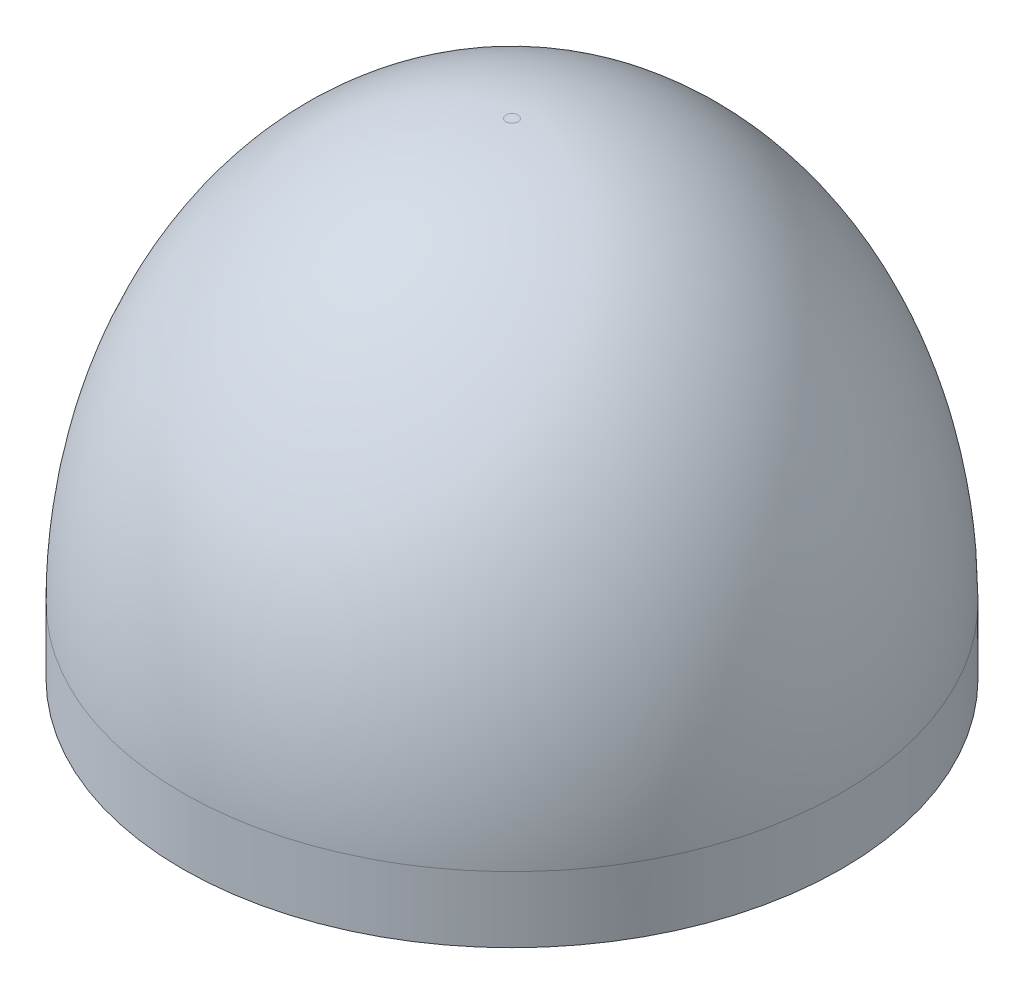
ISO-10303-21;
HEADER;
FILE_DESCRIPTION(('STEP AP214'),'2;1');
FILE_NAME('part.step','',(''),(''),'','','');
FILE_SCHEMA(('AUTOMOTIVE_DESIGN { 1 0 10303 214 1 1 1 1 }'));
ENDSEC;
DATA;
#1=APPLICATION_CONTEXT('core data for automotive mechanical design processes');
#2=APPLICATION_PROTOCOL_DEFINITION('international standard','automotive_design',2000,#1);
#3=PRODUCT_CONTEXT('',#1,'mechanical');
#4=PRODUCT('Part','Part','',(#3));
#5=PRODUCT_RELATED_PRODUCT_CATEGORY('part','',(#4));
#6=PRODUCT_DEFINITION_FORMATION('','',#4);
#7=PRODUCT_DEFINITION_CONTEXT('part definition',#1,'design');
#8=PRODUCT_DEFINITION('design','',#6,#7);
#9=PRODUCT_DEFINITION_SHAPE('','',#8);
#10=(LENGTH_UNIT() NAMED_UNIT(*) SI_UNIT(.MILLI.,.METRE.));
#11=(NAMED_UNIT(*) PLANE_ANGLE_UNIT() SI_UNIT($,.RADIAN.));
#12=(NAMED_UNIT(*) SI_UNIT($,.STERADIAN.) SOLID_ANGLE_UNIT());
#13=UNCERTAINTY_MEASURE_WITH_UNIT(LENGTH_MEASURE(1.E-05),#10,'distance_accuracy_value','');
#14=(GEOMETRIC_REPRESENTATION_CONTEXT(3) GLOBAL_UNCERTAINTY_ASSIGNED_CONTEXT((#13)) GLOBAL_UNIT_ASSIGNED_CONTEXT((#10,
#11,#12)) REPRESENTATION_CONTEXT('',''));
#15=CARTESIAN_POINT('',(0.,0.,0.));
#16=DIRECTION('',(0.,0.,1.));
#17=DIRECTION('',(1.,0.,0.));
#18=AXIS2_PLACEMENT_3D('',#15,#16,#17);
#19=CARTESIAN_POINT('',(0.,3.,0.));
#20=DIRECTION('',(0.,1.,0.));
#21=DIRECTION('',(0.,0.,1.));
#22=AXIS2_PLACEMENT_3D('',#19,#20,#21);
#23=PLANE('',#22);
#24=CARTESIAN_POINT('',(-41.7499999999988,3.,1.18404991852615E-12));
#25=DIRECTION('',(0.,1.,0.));
#26=DIRECTION('',(0.,0.,1.));
#27=AXIS2_PLACEMENT_3D('',#24,#25,#26);
#28=CIRCLE('',#27,1.45);
#29=CARTESIAN_POINT('',(-41.7499999999988,3.,1.45000000000118));
#30=VERTEX_POINT('',#29);
#31=EDGE_CURVE('E348',#30,#30,#28,.T.);
#32=ORIENTED_EDGE('',*,*,#31,.F.);
#33=EDGE_LOOP('',(#32));
#34=FACE_BOUND('',#33,.T.);
#35=CARTESIAN_POINT('',(41.7500000000012,3.,-1.17893701813971E-12));
#36=DIRECTION('',(0.,1.,0.));
#37=DIRECTION('',(0.,0.,1.));
#38=AXIS2_PLACEMENT_3D('',#35,#36,#37);
#39=CIRCLE('',#38,1.45);
#40=CARTESIAN_POINT('',(41.7500000000012,3.,1.44999999999882));
#41=VERTEX_POINT('',#40);
#42=EDGE_CURVE('E357',#41,#41,#39,.T.);
#43=ORIENTED_EDGE('',*,*,#42,.F.);
#44=EDGE_LOOP('',(#43));
#45=FACE_BOUND('',#44,.T.);
#46=CARTESIAN_POINT('',(0.,3.,0.));
#47=DIRECTION('',(0.,1.,0.));
#48=DIRECTION('',(0.,0.,1.));
#49=AXIS2_PLACEMENT_3D('',#46,#47,#48);
#50=CIRCLE('',#49,36.5);
#51=CARTESIAN_POINT('',(0.,3.,36.5));
#52=VERTEX_POINT('',#51);
#53=EDGE_CURVE('E78',#52,#52,#50,.T.);
#54=ORIENTED_EDGE('',*,*,#53,.F.);
#55=EDGE_LOOP('',(#54));
#56=FACE_BOUND('',#55,.T.);
#57=CARTESIAN_POINT('',(0.,3.,-41.75));
#58=DIRECTION('',(0.,1.,0.));
#59=DIRECTION('',(0.,0.,1.));
#60=AXIS2_PLACEMENT_3D('',#57,#58,#59);
#61=CIRCLE('',#60,1.45);
#62=CARTESIAN_POINT('',(0.,3.,-40.3));
#63=VERTEX_POINT('',#62);
#64=EDGE_CURVE('E361',#63,#63,#61,.T.);
#65=ORIENTED_EDGE('',*,*,#64,.F.);
#66=EDGE_LOOP('',(#65));
#67=FACE_BOUND('',#66,.T.);
#68=CARTESIAN_POINT('',(2.35787403627941E-12,3.,41.75));
#69=DIRECTION('',(0.,1.,0.));
#70=DIRECTION('',(0.,0.,1.));
#71=AXIS2_PLACEMENT_3D('',#68,#69,#70);
#72=CIRCLE('',#71,1.45);
#73=CARTESIAN_POINT('',(2.35787403627941E-12,3.,43.2));
#74=VERTEX_POINT('',#73);
#75=EDGE_CURVE('E353',#74,#74,#72,.T.);
#76=ORIENTED_EDGE('',*,*,#75,.F.);
#77=EDGE_LOOP('',(#76));
#78=FACE_BOUND('',#77,.T.);
#79=CARTESIAN_POINT('',(0.,3.,0.));
#80=DIRECTION('',(0.,1.,0.));
#81=DIRECTION('',(0.,0.,1.));
#82=AXIS2_PLACEMENT_3D('',#79,#80,#81);
#83=CIRCLE('',#82,52.);
#84=CARTESIAN_POINT('',(0.,3.,52.));
#85=VERTEX_POINT('',#84);
#86=EDGE_CURVE('E68',#85,#85,#83,.F.);
#87=ORIENTED_EDGE('',*,*,#86,.F.);
#88=EDGE_LOOP('',(#87));
#89=FACE_BOUND('',#88,.T.);
#90=ADVANCED_FACE('F40',(#34,#45,#56,#67,#78,#89),#23,.T.);
#91=CARTESIAN_POINT('',(0.,0.,0.));
#92=DIRECTION('',(0.,1.,0.));
#93=DIRECTION('',(0.,0.,1.));
#94=AXIS2_PLACEMENT_3D('',#91,#92,#93);
#95=PLANE('',#94);
#96=CARTESIAN_POINT('',(0.,0.,0.));
#97=DIRECTION('',(0.,1.,0.));
#98=DIRECTION('',(0.,0.,1.));
#99=AXIS2_PLACEMENT_3D('',#96,#97,#98);
#100=CIRCLE('',#99,55.);
#101=CARTESIAN_POINT('',(0.,0.,55.));
#102=VERTEX_POINT('',#101);
#103=EDGE_CURVE('E73',#102,#102,#100,.T.);
#104=ORIENTED_EDGE('',*,*,#103,.F.);
#105=EDGE_LOOP('',(#104));
#106=FACE_BOUND('',#105,.T.);
#107=CARTESIAN_POINT('',(0.,0.,0.));
#108=DIRECTION('',(0.,1.,0.));
#109=DIRECTION('',(0.,0.,1.));
#110=AXIS2_PLACEMENT_3D('',#107,#108,#109);
#111=CIRCLE('',#110,36.5);
#112=CARTESIAN_POINT('',(0.,0.,36.5));
#113=VERTEX_POINT('',#112);
#114=EDGE_CURVE('E331',#113,#113,#111,.T.);
#115=ORIENTED_EDGE('',*,*,#114,.T.);
#116=EDGE_LOOP('',(#115));
#117=FACE_BOUND('',#116,.T.);
#118=CARTESIAN_POINT('',(0.,0.,-41.75));
#119=DIRECTION('',(0.,1.,0.));
#120=DIRECTION('',(0.,0.,1.));
#121=AXIS2_PLACEMENT_3D('',#118,#119,#120);
#122=CIRCLE('',#121,1.45);
#123=CARTESIAN_POINT('',(0.,0.,-40.3));
#124=VERTEX_POINT('',#123);
#125=EDGE_CURVE('E335',#124,#124,#122,.T.);
#126=ORIENTED_EDGE('',*,*,#125,.T.);
#127=EDGE_LOOP('',(#126));
#128=FACE_BOUND('',#127,.T.);
#129=CARTESIAN_POINT('',(41.7500000000012,0.,-1.17893701813971E-12));
#130=DIRECTION('',(0.,1.,0.));
#131=DIRECTION('',(0.,0.,1.));
#132=AXIS2_PLACEMENT_3D('',#129,#130,#131);
#133=CIRCLE('',#132,1.45);
#134=CARTESIAN_POINT('',(41.7500000000012,0.,1.44999999999882));
#135=VERTEX_POINT('',#134);
#136=EDGE_CURVE('E339',#135,#135,#133,.T.);
#137=ORIENTED_EDGE('',*,*,#136,.T.);
#138=EDGE_LOOP('',(#137));
#139=FACE_BOUND('',#138,.T.);
#140=CARTESIAN_POINT('',(2.35787403627941E-12,0.,41.75));
#141=DIRECTION('',(0.,1.,0.));
#142=DIRECTION('',(0.,0.,1.));
#143=AXIS2_PLACEMENT_3D('',#140,#141,#142);
#144=CIRCLE('',#143,1.45);
#145=CARTESIAN_POINT('',(2.35787403627941E-12,0.,43.2));
#146=VERTEX_POINT('',#145);
#147=EDGE_CURVE('E343',#146,#146,#144,.T.);
#148=ORIENTED_EDGE('',*,*,#147,.T.);
#149=EDGE_LOOP('',(#148));
#150=FACE_BOUND('',#149,.T.);
#151=CARTESIAN_POINT('',(-41.7499999999988,0.,1.18404991852615E-12));
#152=DIRECTION('',(0.,1.,0.));
#153=DIRECTION('',(0.,0.,1.));
#154=AXIS2_PLACEMENT_3D('',#151,#152,#153);
#155=CIRCLE('',#154,1.45);
#156=CARTESIAN_POINT('',(-41.7499999999988,0.,1.45000000000118));
#157=VERTEX_POINT('',#156);
#158=EDGE_CURVE('E346',#157,#157,#155,.T.);
#159=ORIENTED_EDGE('',*,*,#158,.T.);
#160=EDGE_LOOP('',(#159));
#161=FACE_BOUND('',#160,.T.);
#162=ADVANCED_FACE('F122',(#106,#117,#128,#139,#150,#161),#95,.F.);
#163=CARTESIAN_POINT('',(0.,3.,0.));
#164=DIRECTION('',(0.,-1.,0.));
#165=DIRECTION('',(0.,0.,-1.));
#166=AXIS2_PLACEMENT_3D('',#163,#164,#165);
#167=CYLINDRICAL_SURFACE('',#166,55.);
#168=CARTESIAN_POINT('',(0.,11.,55.));
#169=CARTESIAN_POINT('',(7.1994819645649,11.,55.));
#170=CARTESIAN_POINT('',(14.3961347483359,11.,53.5684967575703));
#171=CARTESIAN_POINT('',(27.699042811824,11.,48.0582518186712));
#172=CARTESIAN_POINT('',(33.8000704470874,11.,43.9816754834328));
#173=CARTESIAN_POINT('',(43.9816754834328,11.,33.8000704470874));
#174=CARTESIAN_POINT('',(48.0582518186712,11.,27.6990428118239));
#175=CARTESIAN_POINT('',(53.5684967575703,11.,14.3961347483359));
#176=CARTESIAN_POINT('',(55.,11.,7.19948196456281));
#177=CARTESIAN_POINT('',(55.,11.,-7.19948196456281));
#178=CARTESIAN_POINT('',(53.5684967575702,11.,-14.3961347483364));
#179=CARTESIAN_POINT('',(48.0582518186714,11.,-27.6990428118235));
#180=CARTESIAN_POINT('',(43.9816754834329,11.,-33.8000704470873));
#181=CARTESIAN_POINT('',(33.8000704470873,11.,-43.981675483433));
#182=CARTESIAN_POINT('',(27.6990428118237,11.,-48.0582518186713));
#183=CARTESIAN_POINT('',(14.3961347483363,11.,-53.5684967575702));
#184=CARTESIAN_POINT('',(7.19948196456282,11.,-55.));
#185=CARTESIAN_POINT('',(-7.1994819645628,11.,-55.));
#186=CARTESIAN_POINT('',(-14.3961347483362,11.,-53.5684967575702));
#187=CARTESIAN_POINT('',(-27.6990428118235,11.,-48.0582518186714));
#188=CARTESIAN_POINT('',(-33.8000704470873,11.,-43.9816754834329));
#189=CARTESIAN_POINT('',(-43.9816754834329,11.,-33.8000704470873));
#190=CARTESIAN_POINT('',(-48.0582518186713,11.,-27.6990428118237));
#191=CARTESIAN_POINT('',(-53.5684967575702,11.,-14.3961347483363));
#192=CARTESIAN_POINT('',(-55.,11.,-7.19948196456273));
#193=CARTESIAN_POINT('',(-55.,11.,7.1994819645629));
#194=CARTESIAN_POINT('',(-53.5684967575702,11.,14.3961347483363));
#195=CARTESIAN_POINT('',(-48.0582518186714,11.,27.6990428118234));
#196=CARTESIAN_POINT('',(-43.9816754834323,11.,33.8000704470879));
#197=CARTESIAN_POINT('',(-33.8000704470881,11.,43.9816754834321));
#198=CARTESIAN_POINT('',(-27.6990428118237,11.,48.0582518186713));
#199=CARTESIAN_POINT('',(-14.3961347483363,11.,53.5684967575702));
#200=CARTESIAN_POINT('',(-7.1994819645649,11.,55.));
#201=CARTESIAN_POINT('',(0.,11.,55.));
#202=(BOUNDED_CURVE() B_SPLINE_CURVE(3,(#168,#169,#170,#171,#172,#173,#174,#175,#176,#177,#178,
#179,#180,#181,#182,#183,#184,#185,#186,#187,#188,#189,#190,#191,#192,#193,#194,#195,#196,#197,
#198,#199,#200,#201),.UNSPECIFIED.,.T.,.F.) B_SPLINE_CURVE_WITH_KNOTS((4,2,2,2,2,2,2,2,2,2,2,2,
2,2,2,2,4),(0.,0.392699081698724,0.785398163397448,1.17809724509617,1.5707963267949,
1.96349540849362,2.35619449019234,2.74889357189107,3.14159265358979,3.53429173528852,
3.92699081698724,4.31968989868597,4.71238898038469,5.10508806208341,5.49778714378214,
5.89048622548086,6.28318530717959),
.UNSPECIFIED.) CURVE() GEOMETRIC_REPRESENTATION_ITEM() RATIONAL_B_SPLINE_CURVE((1.,1.,1.,1.,1.,
1.,1.,1.,1.,1.,1.,1.,1.,1.,1.,1.,1.,1.,1.,1.,1.,1.,1.,1.,1.,1.,1.,1.,1.,1.,1.,1.,1.,1.)) REPRESENTATION_ITEM(''));
#203=CARTESIAN_POINT('',(0.,11.,55.));
#204=VERTEX_POINT('',#203);
#205=EDGE_CURVE('E11',#204,#204,#202,.F.);
#206=ORIENTED_EDGE('',*,*,#205,.T.);
#207=EDGE_LOOP('',(#206));
#208=FACE_BOUND('',#207,.T.);
#209=ORIENTED_EDGE('',*,*,#103,.T.);
#210=EDGE_LOOP('',(#209));
#211=FACE_BOUND('',#210,.T.);
#212=ADVANCED_FACE('F118',(#208,#211),#167,.T.);
#213=CARTESIAN_POINT('',(0.,3.,0.));
#214=DIRECTION('',(0.,-1.,0.));
#215=DIRECTION('',(0.,0.,-1.));
#216=AXIS2_PLACEMENT_3D('',#213,#214,#215);
#217=CYLINDRICAL_SURFACE('',#216,36.5);
#218=ORIENTED_EDGE('',*,*,#53,.T.);
#219=EDGE_LOOP('',(#218));
#220=FACE_BOUND('',#219,.T.);
#221=ORIENTED_EDGE('',*,*,#114,.F.);
#222=EDGE_LOOP('',(#221));
#223=FACE_BOUND('',#222,.T.);
#224=ADVANCED_FACE('F114',(#220,#223),#217,.F.);
#225=CARTESIAN_POINT('',(0.,3.,-41.75));
#226=DIRECTION('',(0.,-1.,0.));
#227=DIRECTION('',(0.,0.,-1.));
#228=AXIS2_PLACEMENT_3D('',#225,#226,#227);
#229=CYLINDRICAL_SURFACE('',#228,1.45);
#230=ORIENTED_EDGE('',*,*,#64,.T.);
#231=EDGE_LOOP('',(#230));
#232=FACE_BOUND('',#231,.T.);
#233=ORIENTED_EDGE('',*,*,#125,.F.);
#234=EDGE_LOOP('',(#233));
#235=FACE_BOUND('',#234,.T.);
#236=ADVANCED_FACE('F110',(#232,#235),#229,.F.);
#237=CARTESIAN_POINT('',(41.7500000000012,3.,-1.17893701813971E-12));
#238=DIRECTION('',(0.,-1.,0.));
#239=DIRECTION('',(0.,0.,-1.));
#240=AXIS2_PLACEMENT_3D('',#237,#238,#239);
#241=CYLINDRICAL_SURFACE('',#240,1.45);
#242=ORIENTED_EDGE('',*,*,#42,.T.);
#243=EDGE_LOOP('',(#242));
#244=FACE_BOUND('',#243,.T.);
#245=ORIENTED_EDGE('',*,*,#136,.F.);
#246=EDGE_LOOP('',(#245));
#247=FACE_BOUND('',#246,.T.);
#248=ADVANCED_FACE('F106',(#244,#247),#241,.F.);
#249=CARTESIAN_POINT('',(2.35787403627941E-12,3.,41.75));
#250=DIRECTION('',(0.,-1.,0.));
#251=DIRECTION('',(0.,0.,-1.));
#252=AXIS2_PLACEMENT_3D('',#249,#250,#251);
#253=CYLINDRICAL_SURFACE('',#252,1.45);
#254=ORIENTED_EDGE('',*,*,#75,.T.);
#255=EDGE_LOOP('',(#254));
#256=FACE_BOUND('',#255,.T.);
#257=ORIENTED_EDGE('',*,*,#147,.F.);
#258=EDGE_LOOP('',(#257));
#259=FACE_BOUND('',#258,.T.);
#260=ADVANCED_FACE('F102',(#256,#259),#253,.F.);
#261=CARTESIAN_POINT('',(-41.7499999999988,3.,1.18404991852615E-12));
#262=DIRECTION('',(0.,-1.,0.));
#263=DIRECTION('',(0.,0.,-1.));
#264=AXIS2_PLACEMENT_3D('',#261,#262,#263);
#265=CYLINDRICAL_SURFACE('',#264,1.45);
#266=ORIENTED_EDGE('',*,*,#31,.T.);
#267=EDGE_LOOP('',(#266));
#268=FACE_BOUND('',#267,.T.);
#269=ORIENTED_EDGE('',*,*,#158,.F.);
#270=EDGE_LOOP('',(#269));
#271=FACE_BOUND('',#270,.T.);
#272=ADVANCED_FACE('F97',(#268,#271),#265,.F.);
#273=CARTESIAN_POINT('',(0.,78.,0.));
#274=DIRECTION('',(0.,-1.,0.));
#275=DIRECTION('',(0.,0.,-1.));
#276=AXIS2_PLACEMENT_3D('',#273,#274,#275);
#277=CYLINDRICAL_SURFACE('',#276,52.);
#278=CARTESIAN_POINT('',(0.,7.99999999999999,52.));
#279=CARTESIAN_POINT('',(-6.80678294831591,7.99999999999999,52.));
#280=CARTESIAN_POINT('',(-13.6108910347905,7.99999999999999,50.6465787526119));
#281=CARTESIAN_POINT('',(-26.188185931179,7.99999999999999,45.4368926285619));
#282=CARTESIAN_POINT('',(-31.9564302408827,7.99999999999999,41.5826750025183));
#283=CARTESIAN_POINT('',(-41.5826750025184,7.99999999999999,31.9564302408825));
#284=CARTESIAN_POINT('',(-45.4368926285621,7.99999999999999,26.1881859311785));
#285=CARTESIAN_POINT('',(-50.6465787526118,7.99999999999999,13.6108910347907));
#286=CARTESIAN_POINT('',(-52.,7.99999999999999,6.80678294831402));
#287=CARTESIAN_POINT('',(-52.,7.99999999999999,-6.80678294831386));
#288=CARTESIAN_POINT('',(-50.6465787526118,7.99999999999999,-13.6108910347908));
#289=CARTESIAN_POINT('',(-45.436892628562,7.99999999999999,-26.1881859311786));
#290=CARTESIAN_POINT('',(-41.5826750025187,7.99999999999999,-31.9564302408822));
#291=CARTESIAN_POINT('',(-31.9564302408823,7.99999999999999,-41.5826750025186));
#292=CARTESIAN_POINT('',(-26.1881859311787,7.99999999999999,-45.436892628562));
#293=CARTESIAN_POINT('',(-13.6108910347905,7.99999999999999,-50.6465787526119));
#294=CARTESIAN_POINT('',(-6.80678294831392,7.99999999999999,-52.));
#295=CARTESIAN_POINT('',(6.80678294831393,7.99999999999999,-52.));
#296=CARTESIAN_POINT('',(13.6108910347906,7.99999999999999,-50.6465787526118));
#297=CARTESIAN_POINT('',(26.1881859311788,7.99999999999999,-45.4368926285619));
#298=CARTESIAN_POINT('',(31.9564302408825,7.99999999999999,-41.5826750025185));
#299=CARTESIAN_POINT('',(41.5826750025184,7.99999999999999,-31.9564302408825));
#300=CARTESIAN_POINT('',(45.436892628562,7.99999999999999,-26.1881859311787));
#301=CARTESIAN_POINT('',(50.6465787526118,7.99999999999999,-13.6108910347906));
#302=CARTESIAN_POINT('',(52.,7.99999999999999,-6.80678294831393));
#303=CARTESIAN_POINT('',(52.,7.99999999999999,6.80678294831393));
#304=CARTESIAN_POINT('',(50.646578752612,7.99999999999999,13.6108910347902));
#305=CARTESIAN_POINT('',(45.4368926285618,7.99999999999999,26.1881859311791));
#306=CARTESIAN_POINT('',(41.5826750025186,7.99999999999999,31.9564302408823));
#307=CARTESIAN_POINT('',(31.9564302408823,7.99999999999999,41.5826750025186));
#308=CARTESIAN_POINT('',(26.1881859311789,7.99999999999999,45.4368926285619));
#309=CARTESIAN_POINT('',(13.6108910347905,7.99999999999999,50.6465787526119));
#310=CARTESIAN_POINT('',(6.8067829483159,7.99999999999999,52.));
#311=CARTESIAN_POINT('',(0.,7.99999999999999,52.));
#312=(BOUNDED_CURVE() B_SPLINE_CURVE(3,(#278,#279,#280,#281,#282,#283,#284,#285,#286,#287,#288,
#289,#290,#291,#292,#293,#294,#295,#296,#297,#298,#299,#300,#301,#302,#303,#304,#305,#306,#307,
#308,#309,#310,#311),.UNSPECIFIED.,.T.,.F.) B_SPLINE_CURVE_WITH_KNOTS((4,2,2,2,2,2,2,2,2,2,2,2,
2,2,2,2,4),(0.,0.392699081698725,0.785398163397448,1.17809724509617,1.5707963267949,
1.96349540849362,2.35619449019234,2.74889357189107,3.14159265358979,3.53429173528852,
3.92699081698724,4.31968989868597,4.71238898038469,5.10508806208341,5.49778714378214,
5.89048622548086,6.28318530717959),
.UNSPECIFIED.) CURVE() GEOMETRIC_REPRESENTATION_ITEM() RATIONAL_B_SPLINE_CURVE((1.,1.,1.,1.,1.,
1.,1.,1.,1.,1.,1.,1.,1.,1.,1.,1.,1.,1.,1.,1.,1.,1.,1.,1.,1.,1.,1.,1.,1.,1.,1.,1.,1.,1.)) REPRESENTATION_ITEM(''));
#313=CARTESIAN_POINT('',(0.,7.99999999999999,52.));
#314=VERTEX_POINT('',#313);
#315=EDGE_CURVE('E63',#314,#314,#312,.F.);
#316=ORIENTED_EDGE('',*,*,#315,.T.);
#317=EDGE_LOOP('',(#316));
#318=FACE_BOUND('',#317,.T.);
#319=ORIENTED_EDGE('',*,*,#86,.T.);
#320=EDGE_LOOP('',(#319));
#321=FACE_BOUND('',#320,.T.);
#322=ADVANCED_FACE('F86',(#318,#321),#277,.F.);
#323=CARTESIAN_POINT('',(0.,78.,0.));
#324=DIRECTION('',(0.,1.,0.));
#325=DIRECTION('',(0.,0.,1.));
#326=AXIS2_PLACEMENT_3D('',#323,#324,#325);
#327=PLANE('',#326);
#328=CARTESIAN_POINT('',(0.,78.,1.));
#329=CARTESIAN_POINT('',(0.130899672082998,78.,1.));
#330=CARTESIAN_POINT('',(0.261747904515201,78.,0.973972668319461));
#331=CARTESIAN_POINT('',(0.503618960214979,78.,0.873786396703114));
#332=CARTESIAN_POINT('',(0.614546735401586,78.,0.799666826971503));
#333=CARTESIAN_POINT('',(0.79966682697151,78.,0.614546735401593));
#334=CARTESIAN_POINT('',(0.873786396703115,78.,0.503618960214978));
#335=CARTESIAN_POINT('',(0.97397266831946,78.,0.261747904515202));
#336=CARTESIAN_POINT('',(1.,78.,0.13089967208296));
#337=CARTESIAN_POINT('',(1.,78.,-0.13089967208296));
#338=CARTESIAN_POINT('',(0.97397266831946,78.,-0.261747904515209));
#339=CARTESIAN_POINT('',(0.873786396703115,78.,-0.503618960214972));
#340=CARTESIAN_POINT('',(0.799666826971505,78.,-0.614546735401591));
#341=CARTESIAN_POINT('',(0.61454673540159,78.,-0.799666826971507));
#342=CARTESIAN_POINT('',(0.50361896021498,78.,-0.873786396703122));
#343=CARTESIAN_POINT('',(0.261747904515203,78.,-0.973972668319452));
#344=CARTESIAN_POINT('',(0.13089967208296,78.,-1.));
#345=CARTESIAN_POINT('',(-0.13089967208296,78.,-1.));
#346=CARTESIAN_POINT('',(-0.261747904515201,78.,-0.97397266831946));
#347=CARTESIAN_POINT('',(-0.503618960214977,78.,-0.873786396703116));
#348=CARTESIAN_POINT('',(-0.614546735401591,78.,-0.799666826971512));
#349=CARTESIAN_POINT('',(-0.799666826971506,78.,-0.614546735401583));
#350=CARTESIAN_POINT('',(-0.873786396703116,78.,-0.503618960214976));
#351=CARTESIAN_POINT('',(-0.973972668319458,78.,-0.261747904515207));
#352=CARTESIAN_POINT('',(-1.,78.,-0.130899672082959));
#353=CARTESIAN_POINT('',(-1.,78.,0.130899672082962));
#354=CARTESIAN_POINT('',(-0.97397266831946,78.,0.261747904515204));
#355=CARTESIAN_POINT('',(-0.873786396703117,78.,0.503618960214973));
#356=CARTESIAN_POINT('',(-0.799666826971502,78.,0.614546735401587));
#357=CARTESIAN_POINT('',(-0.614546735401598,78.,0.799666826971505));
#358=CARTESIAN_POINT('',(-0.503618960214979,78.,0.873786396703116));
#359=CARTESIAN_POINT('',(-0.261747904515204,78.,0.973972668319458));
#360=CARTESIAN_POINT('',(-0.130899672082998,78.,1.));
#361=CARTESIAN_POINT('',(0.,78.,1.));
#362=(BOUNDED_CURVE() B_SPLINE_CURVE(3,(#328,#329,#330,#331,#332,#333,#334,#335,#336,#337,#338,
#339,#340,#341,#342,#343,#344,#345,#346,#347,#348,#349,#350,#351,#352,#353,#354,#355,#356,#357,
#358,#359,#360,#361),.UNSPECIFIED.,.T.,.F.) B_SPLINE_CURVE_WITH_KNOTS((4,2,2,2,2,2,2,2,2,2,2,2,
2,2,2,2,4),(0.,0.392699081698724,0.785398163397448,1.17809724509617,1.5707963267949,
1.96349540849362,2.35619449019234,2.74889357189107,3.14159265358979,3.53429173528852,
3.92699081698724,4.31968989868597,4.71238898038469,5.10508806208341,5.49778714378214,
5.89048622548086,6.28318530717959),
.UNSPECIFIED.) CURVE() GEOMETRIC_REPRESENTATION_ITEM() RATIONAL_B_SPLINE_CURVE((1.,1.,1.,1.,1.,
1.,1.,1.,1.,1.,1.,1.,1.,1.,1.,1.,1.,1.,1.,1.,1.,1.,1.,1.,1.,1.,1.,1.,1.,1.,1.,1.,1.,1.)) REPRESENTATION_ITEM(''));
#363=CARTESIAN_POINT('',(0.,78.,1.));
#364=VERTEX_POINT('',#363);
#365=EDGE_CURVE('E58',#364,#364,#362,.F.);
#366=ORIENTED_EDGE('',*,*,#365,.T.);
#367=EDGE_LOOP('',(#366));
#368=FACE_BOUND('',#367,.T.);
#369=ADVANCED_FACE('F96',(#368),#327,.F.);
#370=CARTESIAN_POINT('',(0.,81.,0.));
#371=DIRECTION('',(0.,1.,0.));
#372=DIRECTION('',(0.,0.,1.));
#373=AXIS2_PLACEMENT_3D('',#370,#371,#372);
#374=PLANE('',#373);
#375=CARTESIAN_POINT('',(0.,81.,1.));
#376=CARTESIAN_POINT('',(-0.130899672082998,81.,1.));
#377=CARTESIAN_POINT('',(-0.261747904515204,81.,0.973972668319458));
#378=CARTESIAN_POINT('',(-0.503618960214979,81.,0.873786396703116));
#379=CARTESIAN_POINT('',(-0.614546735401598,81.,0.799666826971505));
#380=CARTESIAN_POINT('',(-0.799666826971502,81.,0.614546735401587));
#381=CARTESIAN_POINT('',(-0.873786396703117,81.,0.503618960214973));
#382=CARTESIAN_POINT('',(-0.97397266831946,81.,0.261747904515204));
#383=CARTESIAN_POINT('',(-1.,81.,0.130899672082962));
#384=CARTESIAN_POINT('',(-1.,81.,-0.130899672082959));
#385=CARTESIAN_POINT('',(-0.973972668319458,81.,-0.261747904515207));
#386=CARTESIAN_POINT('',(-0.873786396703116,81.,-0.503618960214976));
#387=CARTESIAN_POINT('',(-0.799666826971506,81.,-0.614546735401583));
#388=CARTESIAN_POINT('',(-0.614546735401591,81.,-0.799666826971512));
#389=CARTESIAN_POINT('',(-0.503618960214977,81.,-0.873786396703116));
#390=CARTESIAN_POINT('',(-0.261747904515201,81.,-0.97397266831946));
#391=CARTESIAN_POINT('',(-0.13089967208296,81.,-1.));
#392=CARTESIAN_POINT('',(0.13089967208296,81.,-1.));
#393=CARTESIAN_POINT('',(0.261747904515203,81.,-0.973972668319452));
#394=CARTESIAN_POINT('',(0.50361896021498,81.,-0.873786396703122));
#395=CARTESIAN_POINT('',(0.61454673540159,81.,-0.799666826971507));
#396=CARTESIAN_POINT('',(0.799666826971505,81.,-0.614546735401591));
#397=CARTESIAN_POINT('',(0.873786396703115,81.,-0.503618960214972));
#398=CARTESIAN_POINT('',(0.97397266831946,81.,-0.261747904515209));
#399=CARTESIAN_POINT('',(1.,81.,-0.13089967208296));
#400=CARTESIAN_POINT('',(1.,81.,0.13089967208296));
#401=CARTESIAN_POINT('',(0.97397266831946,81.,0.261747904515202));
#402=CARTESIAN_POINT('',(0.873786396703115,81.,0.503618960214978));
#403=CARTESIAN_POINT('',(0.79966682697151,81.,0.614546735401593));
#404=CARTESIAN_POINT('',(0.614546735401586,81.,0.799666826971503));
#405=CARTESIAN_POINT('',(0.503618960214979,81.,0.873786396703114));
#406=CARTESIAN_POINT('',(0.261747904515201,81.,0.973972668319461));
#407=CARTESIAN_POINT('',(0.130899672082998,81.,1.));
#408=CARTESIAN_POINT('',(0.,81.,1.));
#409=(BOUNDED_CURVE() B_SPLINE_CURVE(3,(#375,#376,#377,#378,#379,#380,#381,#382,#383,#384,#385,
#386,#387,#388,#389,#390,#391,#392,#393,#394,#395,#396,#397,#398,#399,#400,#401,#402,#403,#404,
#405,#406,#407,#408),.UNSPECIFIED.,.T.,.F.) B_SPLINE_CURVE_WITH_KNOTS((4,2,2,2,2,2,2,2,2,2,2,2,
2,2,2,2,4),(0.,0.392699081698725,0.785398163397448,1.17809724509617,1.5707963267949,
1.96349540849362,2.35619449019234,2.74889357189107,3.14159265358979,3.53429173528852,
3.92699081698724,4.31968989868597,4.71238898038469,5.10508806208341,5.49778714378214,
5.89048622548086,6.28318530717959),
.UNSPECIFIED.) CURVE() GEOMETRIC_REPRESENTATION_ITEM() RATIONAL_B_SPLINE_CURVE((1.,1.,1.,1.,1.,
1.,1.,1.,1.,1.,1.,1.,1.,1.,1.,1.,1.,1.,1.,1.,1.,1.,1.,1.,1.,1.,1.,1.,1.,1.,1.,1.,1.,1.)) REPRESENTATION_ITEM(''));
#410=CARTESIAN_POINT('',(0.,81.,1.));
#411=VERTEX_POINT('',#410);
#412=EDGE_CURVE('E53',#411,#411,#409,.F.);
#413=ORIENTED_EDGE('',*,*,#412,.T.);
#414=EDGE_LOOP('',(#413));
#415=FACE_BOUND('',#414,.T.);
#416=ADVANCED_FACE('F158',(#415),#374,.T.);
#417=CARTESIAN_POINT('',(0.,7.99999999999999,52.));
#418=CARTESIAN_POINT('',(6.8067829483159,7.99999999999999,52.));
#419=CARTESIAN_POINT('',(13.6108910347905,7.99999999999999,50.6465787526119));
#420=CARTESIAN_POINT('',(26.1881859311789,7.99999999999999,45.4368926285619));
#421=CARTESIAN_POINT('',(31.9564302408823,7.99999999999999,41.5826750025186));
#422=CARTESIAN_POINT('',(41.5826750025186,7.99999999999999,31.9564302408823));
#423=CARTESIAN_POINT('',(45.4368926285618,7.99999999999999,26.1881859311791));
#424=CARTESIAN_POINT('',(50.646578752612,7.99999999999999,13.6108910347902));
#425=CARTESIAN_POINT('',(52.,7.99999999999999,6.80678294831393));
#426=CARTESIAN_POINT('',(52.,7.99999999999999,-6.80678294831393));
#427=CARTESIAN_POINT('',(50.6465787526118,7.99999999999999,-13.6108910347906));
#428=CARTESIAN_POINT('',(45.436892628562,7.99999999999999,-26.1881859311787));
#429=CARTESIAN_POINT('',(41.5826750025184,7.99999999999999,-31.9564302408825));
#430=CARTESIAN_POINT('',(31.9564302408825,7.99999999999999,-41.5826750025185));
#431=CARTESIAN_POINT('',(26.1881859311788,7.99999999999999,-45.4368926285619));
#432=CARTESIAN_POINT('',(13.6108910347906,7.99999999999999,-50.6465787526118));
#433=CARTESIAN_POINT('',(6.80678294831393,7.99999999999999,-52.));
#434=CARTESIAN_POINT('',(-6.80678294831392,7.99999999999999,-52.));
#435=CARTESIAN_POINT('',(-13.6108910347905,7.99999999999999,-50.6465787526119));
#436=CARTESIAN_POINT('',(-26.1881859311787,7.99999999999999,-45.436892628562));
#437=CARTESIAN_POINT('',(-31.9564302408823,7.99999999999999,-41.5826750025186));
#438=CARTESIAN_POINT('',(-41.5826750025187,7.99999999999999,-31.9564302408822));
#439=CARTESIAN_POINT('',(-45.436892628562,7.99999999999999,-26.1881859311786));
#440=CARTESIAN_POINT('',(-50.6465787526118,7.99999999999999,-13.6108910347908));
#441=CARTESIAN_POINT('',(-52.,7.99999999999999,-6.80678294831386));
#442=CARTESIAN_POINT('',(-52.,7.99999999999999,6.80678294831402));
#443=CARTESIAN_POINT('',(-50.6465787526118,7.99999999999999,13.6108910347907));
#444=CARTESIAN_POINT('',(-45.4368926285621,7.99999999999999,26.1881859311785));
#445=CARTESIAN_POINT('',(-41.5826750025184,7.99999999999999,31.9564302408825));
#446=CARTESIAN_POINT('',(-31.9564302408827,7.99999999999999,41.5826750025183));
#447=CARTESIAN_POINT('',(-26.188185931179,7.99999999999999,45.4368926285619));
#448=CARTESIAN_POINT('',(-13.6108910347905,7.99999999999999,50.6465787526119));
#449=CARTESIAN_POINT('',(-6.80678294831591,7.99999999999999,52.));
#450=CARTESIAN_POINT('',(0.,7.99999999999999,52.));
#451=CARTESIAN_POINT('',(0.,78.,52.));
#452=CARTESIAN_POINT('',(6.8067829483159,78.,51.9999999999986));
#453=CARTESIAN_POINT('',(13.6108910347902,78.,50.6465787526117));
#454=CARTESIAN_POINT('',(26.1881859311791,78.,45.4368926285621));
#455=CARTESIAN_POINT('',(31.9564302408821,78.,41.5826750025184));
#456=CARTESIAN_POINT('',(41.5826750025188,78.,31.9564302408826));
#457=CARTESIAN_POINT('',(45.4368926285618,78.,26.1881859311791));
#458=CARTESIAN_POINT('',(50.646578752612,78.,13.6108910347902));
#459=CARTESIAN_POINT('',(52.,78.,6.80678294831393));
#460=CARTESIAN_POINT('',(52.,78.,-6.80678294831393));
#461=CARTESIAN_POINT('',(50.6465787526129,78.,-13.6108910347914));
#462=CARTESIAN_POINT('',(45.4368926285609,78.,-26.188185931178));
#463=CARTESIAN_POINT('',(41.5826750025171,78.,-31.9564302408825));
#464=CARTESIAN_POINT('',(31.9564302408838,78.,-41.5826750025185));
#465=CARTESIAN_POINT('',(26.188185931179,78.,-45.4368926285627));
#466=CARTESIAN_POINT('',(13.6108910347905,78.,-50.6465787526111));
#467=CARTESIAN_POINT('',(6.80678294831393,78.,-52.));
#468=CARTESIAN_POINT('',(-6.80678294831392,78.,-52.));
#469=CARTESIAN_POINT('',(-13.6108910347901,78.,-50.6465787526111));
#470=CARTESIAN_POINT('',(-26.1881859311791,78.,-45.4368926285628));
#471=CARTESIAN_POINT('',(-31.9564302408825,78.,-41.5826750025184));
#472=CARTESIAN_POINT('',(-41.5826750025185,78.,-31.9564302408825));
#473=CARTESIAN_POINT('',(-45.436892628562,78.,-26.1881859311784));
#474=CARTESIAN_POINT('',(-50.6465787526117,78.,-13.610891034791));
#475=CARTESIAN_POINT('',(-51.9999999999995,78.,-6.80678294831386));
#476=CARTESIAN_POINT('',(-52.0000000000004,78.,6.80678294831402));
#477=CARTESIAN_POINT('',(-50.6465787526118,78.,13.6108910347909));
#478=CARTESIAN_POINT('',(-45.4368926285621,78.,26.1881859311783));
#479=CARTESIAN_POINT('',(-41.5826750025187,78.,31.9564302408827));
#480=CARTESIAN_POINT('',(-31.9564302408825,78.,41.582675002518));
#481=CARTESIAN_POINT('',(-26.1881859311787,78.,45.4368926285616));
#482=CARTESIAN_POINT('',(-13.6108910347908,78.,50.6465787526122));
#483=CARTESIAN_POINT('',(-6.80678294831591,78.,52.0000000000014));
#484=CARTESIAN_POINT('',(0.,78.,52.));
#485=CARTESIAN_POINT('',(0.,78.,1.));
#486=CARTESIAN_POINT('',(0.130899672082998,78.,1.));
#487=CARTESIAN_POINT('',(0.261747904515201,78.,0.973972668319461));
#488=CARTESIAN_POINT('',(0.503618960214979,78.,0.873786396703114));
#489=CARTESIAN_POINT('',(0.614546735401586,78.,0.799666826971503));
#490=CARTESIAN_POINT('',(0.79966682697151,78.,0.614546735401593));
#491=CARTESIAN_POINT('',(0.873786396703115,78.,0.503618960214978));
#492=CARTESIAN_POINT('',(0.97397266831946,78.,0.261747904515202));
#493=CARTESIAN_POINT('',(1.,78.,0.13089967208296));
#494=CARTESIAN_POINT('',(1.,78.,-0.13089967208296));
#495=CARTESIAN_POINT('',(0.97397266831946,78.,-0.261747904515209));
#496=CARTESIAN_POINT('',(0.873786396703115,78.,-0.503618960214972));
#497=CARTESIAN_POINT('',(0.799666826971505,78.,-0.614546735401591));
#498=CARTESIAN_POINT('',(0.61454673540159,78.,-0.799666826971507));
#499=CARTESIAN_POINT('',(0.50361896021498,78.,-0.873786396703122));
#500=CARTESIAN_POINT('',(0.261747904515203,78.,-0.973972668319452));
#501=CARTESIAN_POINT('',(0.13089967208296,78.,-1.));
#502=CARTESIAN_POINT('',(-0.13089967208296,78.,-1.));
#503=CARTESIAN_POINT('',(-0.261747904515201,78.,-0.97397266831946));
#504=CARTESIAN_POINT('',(-0.503618960214977,78.,-0.873786396703116));
#505=CARTESIAN_POINT('',(-0.614546735401591,78.,-0.799666826971512));
#506=CARTESIAN_POINT('',(-0.799666826971506,78.,-0.614546735401583));
#507=CARTESIAN_POINT('',(-0.873786396703116,78.,-0.503618960214976));
#508=CARTESIAN_POINT('',(-0.973972668319458,78.,-0.261747904515207));
#509=CARTESIAN_POINT('',(-1.,78.,-0.130899672082959));
#510=CARTESIAN_POINT('',(-1.,78.,0.130899672082962));
#511=CARTESIAN_POINT('',(-0.97397266831946,78.,0.261747904515204));
#512=CARTESIAN_POINT('',(-0.873786396703117,78.,0.503618960214973));
#513=CARTESIAN_POINT('',(-0.799666826971502,78.,0.614546735401587));
#514=CARTESIAN_POINT('',(-0.614546735401598,78.,0.799666826971505));
#515=CARTESIAN_POINT('',(-0.503618960214979,78.,0.873786396703116));
#516=CARTESIAN_POINT('',(-0.261747904515204,78.,0.973972668319458));
#517=CARTESIAN_POINT('',(-0.130899672082998,78.,1.));
#518=CARTESIAN_POINT('',(0.,78.,1.));
#519=(BOUNDED_SURFACE() B_SPLINE_SURFACE(2,3,((#417,#418,#419,#420,#421,#422,#423,#424,#425,
#426,#427,#428,#429,#430,#431,#432,#433,#434,#435,#436,#437,#438,#439,#440,#441,#442,#443,#444,
#445,#446,#447,#448,#449,#450),(#451,#452,#453,#454,#455,#456,#457,#458,#459,#460,#461,#462,
#463,#464,#465,#466,#467,#468,#469,#470,#471,#472,#473,#474,#475,#476,#477,#478,#479,#480,#481,
#482,#483,#484),(#485,#486,#487,#488,#489,#490,#491,#492,#493,#494,#495,#496,#497,#498,#499,
#500,#501,#502,#503,#504,#505,#506,#507,#508,#509,#510,#511,#512,#513,#514,#515,#516,#517,
#518)),.UNSPECIFIED.,.F.,.T.,.F.) B_SPLINE_SURFACE_WITH_KNOTS((3,3),(4,2,2,2,2,2,2,2,2,2,2,2,2,
2,2,2,4),(0.,1.),(0.,0.392699081698724,0.785398163397448,1.17809724509617,1.5707963267949,
1.96349540849362,2.35619449019234,2.74889357189107,3.14159265358979,3.53429173528852,
3.92699081698724,4.31968989868597,4.71238898038469,5.10508806208341,5.49778714378214,
5.89048622548086,6.28318530717959),
.UNSPECIFIED.) GEOMETRIC_REPRESENTATION_ITEM() RATIONAL_B_SPLINE_SURFACE(((1.,1.,1.,1.,1.,1.,1.,
1.,1.,1.,1.,1.,1.,1.,1.,1.,1.,1.,1.,1.,1.,1.,1.,1.,1.,1.,1.,1.,1.,1.,1.,1.,1.,1.),
(0.707106781186548,0.707106781186548,0.707106781186548,0.707106781186548,0.707106781186548,
0.707106781186548,0.707106781186548,0.707106781186548,0.707106781186548,0.707106781186548,
0.707106781186548,0.707106781186548,0.707106781186548,0.707106781186548,0.707106781186548,
0.707106781186548,0.707106781186548,0.707106781186548,0.707106781186548,0.707106781186548,
0.707106781186548,0.707106781186548,0.707106781186548,0.707106781186548,0.707106781186548,
0.707106781186548,0.707106781186548,0.707106781186548,0.707106781186548,0.707106781186548,
0.707106781186548,0.707106781186548,0.707106781186548,0.707106781186548),(1.,1.,1.,1.,1.,1.,1.,
1.,1.,1.,1.,1.,1.,1.,1.,1.,1.,1.,1.,1.,1.,1.,1.,1.,1.,1.,1.,1.,1.,1.,1.,1.,1.,1.))) REPRESENTATION_ITEM('') SURFACE());
#520=ORIENTED_EDGE('',*,*,#365,.F.);
#521=EDGE_LOOP('',(#520));
#522=FACE_BOUND('',#521,.T.);
#523=ORIENTED_EDGE('',*,*,#315,.F.);
#524=EDGE_LOOP('',(#523));
#525=FACE_BOUND('',#524,.T.);
#526=ADVANCED_FACE('F130',(#522,#525),#519,.T.);
#527=CARTESIAN_POINT('',(0.,81.,1.));
#528=CARTESIAN_POINT('',(0.130899672082998,81.,1.));
#529=CARTESIAN_POINT('',(0.261747904515201,81.,0.973972668319461));
#530=CARTESIAN_POINT('',(0.503618960214979,81.,0.873786396703114));
#531=CARTESIAN_POINT('',(0.614546735401586,81.,0.799666826971503));
#532=CARTESIAN_POINT('',(0.79966682697151,81.,0.614546735401593));
#533=CARTESIAN_POINT('',(0.873786396703115,81.,0.503618960214978));
#534=CARTESIAN_POINT('',(0.97397266831946,81.,0.261747904515202));
#535=CARTESIAN_POINT('',(1.,81.,0.13089967208296));
#536=CARTESIAN_POINT('',(1.,81.,-0.13089967208296));
#537=CARTESIAN_POINT('',(0.97397266831946,81.,-0.261747904515209));
#538=CARTESIAN_POINT('',(0.873786396703115,81.,-0.503618960214972));
#539=CARTESIAN_POINT('',(0.799666826971505,81.,-0.614546735401591));
#540=CARTESIAN_POINT('',(0.61454673540159,81.,-0.799666826971507));
#541=CARTESIAN_POINT('',(0.50361896021498,81.,-0.873786396703122));
#542=CARTESIAN_POINT('',(0.261747904515203,81.,-0.973972668319452));
#543=CARTESIAN_POINT('',(0.13089967208296,81.,-1.));
#544=CARTESIAN_POINT('',(-0.13089967208296,81.,-1.));
#545=CARTESIAN_POINT('',(-0.261747904515201,81.,-0.97397266831946));
#546=CARTESIAN_POINT('',(-0.503618960214977,81.,-0.873786396703116));
#547=CARTESIAN_POINT('',(-0.614546735401591,81.,-0.799666826971512));
#548=CARTESIAN_POINT('',(-0.799666826971506,81.,-0.614546735401583));
#549=CARTESIAN_POINT('',(-0.873786396703116,81.,-0.503618960214976));
#550=CARTESIAN_POINT('',(-0.973972668319458,81.,-0.261747904515207));
#551=CARTESIAN_POINT('',(-1.,81.,-0.130899672082959));
#552=CARTESIAN_POINT('',(-1.,81.,0.130899672082962));
#553=CARTESIAN_POINT('',(-0.97397266831946,81.,0.261747904515204));
#554=CARTESIAN_POINT('',(-0.873786396703117,81.,0.503618960214973));
#555=CARTESIAN_POINT('',(-0.799666826971502,81.,0.614546735401587));
#556=CARTESIAN_POINT('',(-0.614546735401598,81.,0.799666826971505));
#557=CARTESIAN_POINT('',(-0.503618960214979,81.,0.873786396703116));
#558=CARTESIAN_POINT('',(-0.261747904515204,81.,0.973972668319458));
#559=CARTESIAN_POINT('',(-0.130899672082998,81.,1.));
#560=CARTESIAN_POINT('',(0.,81.,1.));
#561=CARTESIAN_POINT('',(0.,81.,55.));
#562=CARTESIAN_POINT('',(7.1994819645649,81.,55.));
#563=CARTESIAN_POINT('',(14.3961347483355,81.,53.5684967575699));
#564=CARTESIAN_POINT('',(27.6990428118244,81.,48.0582518186716));
#565=CARTESIAN_POINT('',(33.8000704470886,81.,43.9816754834335));
#566=CARTESIAN_POINT('',(43.9816754834317,81.,33.8000704470867));
#567=CARTESIAN_POINT('',(48.0582518186713,81.,27.699042811824));
#568=CARTESIAN_POINT('',(53.5684967575702,81.,14.3961347483359));
#569=CARTESIAN_POINT('',(55.,81.,7.19948196456281));
#570=CARTESIAN_POINT('',(55.,81.,-7.19948196456281));
#571=CARTESIAN_POINT('',(53.5684967575707,81.,-14.3961347483368));
#572=CARTESIAN_POINT('',(48.0582518186708,81.,-27.6990428118231));
#573=CARTESIAN_POINT('',(43.9816754834322,81.,-33.8000704470876));
#574=CARTESIAN_POINT('',(33.800070447088,81.,-43.9816754834327));
#575=CARTESIAN_POINT('',(27.6990428118243,81.,-48.0582518186731));
#576=CARTESIAN_POINT('',(14.3961347483357,81.,-53.5684967575684));
#577=CARTESIAN_POINT('',(7.19948196456282,81.,-55.));
#578=CARTESIAN_POINT('',(-7.1994819645628,81.,-55.));
#579=CARTESIAN_POINT('',(-14.396134748336,81.,-53.5684967575703));
#580=CARTESIAN_POINT('',(-27.6990428118237,81.,-48.0582518186713));
#581=CARTESIAN_POINT('',(-33.8000704470876,81.,-43.9816754834327));
#582=CARTESIAN_POINT('',(-43.9816754834327,81.,-33.8000704470875));
#583=CARTESIAN_POINT('',(-48.0582518186711,81.,-27.6990428118236));
#584=CARTESIAN_POINT('',(-53.5684967575703,81.,-14.3961347483364));
#585=CARTESIAN_POINT('',(-54.9999999999991,81.,-7.19948196456273));
#586=CARTESIAN_POINT('',(-55.0000000000009,81.,7.1994819645629));
#587=CARTESIAN_POINT('',(-53.5684967575695,81.,14.3961347483363));
#588=CARTESIAN_POINT('',(-48.0582518186721,81.,27.6990428118235));
#589=CARTESIAN_POINT('',(-43.9816754834324,81.,33.8000704470883));
#590=CARTESIAN_POINT('',(-33.8000704470881,81.,43.9816754834317));
#591=CARTESIAN_POINT('',(-27.6990428118238,81.,48.0582518186716));
#592=CARTESIAN_POINT('',(-14.3961347483362,81.,53.5684967575699));
#593=CARTESIAN_POINT('',(-7.1994819645649,81.,55.));
#594=CARTESIAN_POINT('',(0.,81.,55.));
#595=CARTESIAN_POINT('',(0.,11.,55.));
#596=CARTESIAN_POINT('',(7.1994819645649,11.,55.));
#597=CARTESIAN_POINT('',(14.3961347483359,11.,53.5684967575703));
#598=CARTESIAN_POINT('',(27.699042811824,11.,48.0582518186712));
#599=CARTESIAN_POINT('',(33.8000704470874,11.,43.9816754834328));
#600=CARTESIAN_POINT('',(43.9816754834328,11.,33.8000704470874));
#601=CARTESIAN_POINT('',(48.0582518186712,11.,27.6990428118239));
#602=CARTESIAN_POINT('',(53.5684967575703,11.,14.3961347483359));
#603=CARTESIAN_POINT('',(55.,11.,7.19948196456281));
#604=CARTESIAN_POINT('',(55.,11.,-7.19948196456281));
#605=CARTESIAN_POINT('',(53.5684967575702,11.,-14.3961347483364));
#606=CARTESIAN_POINT('',(48.0582518186714,11.,-27.6990428118235));
#607=CARTESIAN_POINT('',(43.9816754834329,11.,-33.8000704470873));
#608=CARTESIAN_POINT('',(33.8000704470873,11.,-43.981675483433));
#609=CARTESIAN_POINT('',(27.6990428118237,11.,-48.0582518186713));
#610=CARTESIAN_POINT('',(14.3961347483363,11.,-53.5684967575702));
#611=CARTESIAN_POINT('',(7.19948196456282,11.,-55.));
#612=CARTESIAN_POINT('',(-7.1994819645628,11.,-55.));
#613=CARTESIAN_POINT('',(-14.3961347483362,11.,-53.5684967575702));
#614=CARTESIAN_POINT('',(-27.6990428118235,11.,-48.0582518186714));
#615=CARTESIAN_POINT('',(-33.8000704470873,11.,-43.9816754834329));
#616=CARTESIAN_POINT('',(-43.9816754834329,11.,-33.8000704470873));
#617=CARTESIAN_POINT('',(-48.0582518186713,11.,-27.6990428118237));
#618=CARTESIAN_POINT('',(-53.5684967575702,11.,-14.3961347483363));
#619=CARTESIAN_POINT('',(-55.,11.,-7.19948196456273));
#620=CARTESIAN_POINT('',(-55.,11.,7.1994819645629));
#621=CARTESIAN_POINT('',(-53.5684967575702,11.,14.3961347483363));
#622=CARTESIAN_POINT('',(-48.0582518186714,11.,27.6990428118234));
#623=CARTESIAN_POINT('',(-43.9816754834323,11.,33.8000704470879));
#624=CARTESIAN_POINT('',(-33.8000704470881,11.,43.9816754834321));
#625=CARTESIAN_POINT('',(-27.6990428118237,11.,48.0582518186713));
#626=CARTESIAN_POINT('',(-14.3961347483363,11.,53.5684967575702));
#627=CARTESIAN_POINT('',(-7.1994819645649,11.,55.));
#628=CARTESIAN_POINT('',(0.,11.,55.));
#629=(BOUNDED_SURFACE() B_SPLINE_SURFACE(2,3,((#527,#528,#529,#530,#531,#532,#533,#534,#535,
#536,#537,#538,#539,#540,#541,#542,#543,#544,#545,#546,#547,#548,#549,#550,#551,#552,#553,#554,
#555,#556,#557,#558,#559,#560),(#561,#562,#563,#564,#565,#566,#567,#568,#569,#570,#571,#572,
#573,#574,#575,#576,#577,#578,#579,#580,#581,#582,#583,#584,#585,#586,#587,#588,#589,#590,#591,
#592,#593,#594),(#595,#596,#597,#598,#599,#600,#601,#602,#603,#604,#605,#606,#607,#608,#609,
#610,#611,#612,#613,#614,#615,#616,#617,#618,#619,#620,#621,#622,#623,#624,#625,#626,#627,
#628)),.UNSPECIFIED.,.F.,.T.,.F.) B_SPLINE_SURFACE_WITH_KNOTS((3,3),(4,2,2,2,2,2,2,2,2,2,2,2,2,
2,2,2,4),(0.,1.),(0.,0.392699081698724,0.785398163397448,1.17809724509617,1.5707963267949,
1.96349540849362,2.35619449019234,2.74889357189107,3.14159265358979,3.53429173528852,
3.92699081698724,4.31968989868597,4.71238898038469,5.10508806208341,5.49778714378214,
5.89048622548086,6.28318530717959),
.UNSPECIFIED.) GEOMETRIC_REPRESENTATION_ITEM() RATIONAL_B_SPLINE_SURFACE(((1.,1.,1.,1.,1.,1.,1.,
1.,1.,1.,1.,1.,1.,1.,1.,1.,1.,1.,1.,1.,1.,1.,1.,1.,1.,1.,1.,1.,1.,1.,1.,1.,1.,1.),
(0.707106781186548,0.707106781186548,0.707106781186548,0.707106781186548,0.707106781186548,
0.707106781186548,0.707106781186548,0.707106781186548,0.707106781186548,0.707106781186548,
0.707106781186548,0.707106781186548,0.707106781186548,0.707106781186548,0.707106781186548,
0.707106781186548,0.707106781186548,0.707106781186548,0.707106781186548,0.707106781186548,
0.707106781186548,0.707106781186548,0.707106781186548,0.707106781186548,0.707106781186548,
0.707106781186548,0.707106781186548,0.707106781186548,0.707106781186548,0.707106781186548,
0.707106781186548,0.707106781186548,0.707106781186548,0.707106781186548),(1.,1.,1.,1.,1.,1.,1.,
1.,1.,1.,1.,1.,1.,1.,1.,1.,1.,1.,1.,1.,1.,1.,1.,1.,1.,1.,1.,1.,1.,1.,1.,1.,1.,1.))) REPRESENTATION_ITEM('') SURFACE());
#630=ORIENTED_EDGE('',*,*,#205,.F.);
#631=EDGE_LOOP('',(#630));
#632=FACE_BOUND('',#631,.T.);
#633=ORIENTED_EDGE('',*,*,#412,.F.);
#634=EDGE_LOOP('',(#633));
#635=FACE_BOUND('',#634,.T.);
#636=ADVANCED_FACE('F43',(#632,#635),#629,.T.);
#637=CLOSED_SHELL('',(#90,#162,#212,#224,#236,#248,#260,#272,#322,#369,#416,#526,#636));
#638=MANIFOLD_SOLID_BREP('B2',#637);
#639=ADVANCED_BREP_SHAPE_REPRESENTATION('',(#18,#638),#14);
#640=SHAPE_DEFINITION_REPRESENTATION(#9,#639);
ENDSEC;
END-ISO-10303-21;
